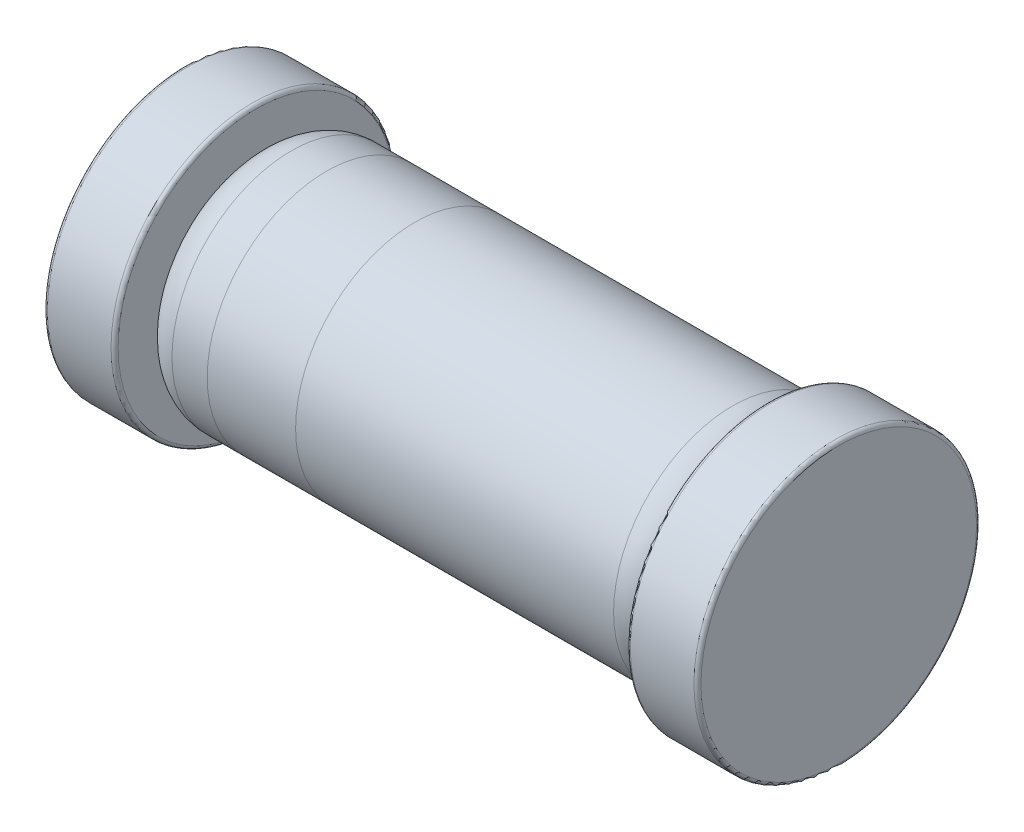
ISO-10303-21;
HEADER;
FILE_DESCRIPTION(('STEP AP214'),'2;1');
FILE_NAME('part.step','',(''),(''),'','','');
FILE_SCHEMA(('AUTOMOTIVE_DESIGN { 1 0 10303 214 1 1 1 1 }'));
ENDSEC;
DATA;
#1=APPLICATION_CONTEXT('core data for automotive mechanical design processes');
#2=APPLICATION_PROTOCOL_DEFINITION('international standard','automotive_design',2000,#1);
#3=PRODUCT_CONTEXT('',#1,'mechanical');
#4=PRODUCT('Part','Part','',(#3));
#5=PRODUCT_RELATED_PRODUCT_CATEGORY('part','',(#4));
#6=PRODUCT_DEFINITION_FORMATION('','',#4);
#7=PRODUCT_DEFINITION_CONTEXT('part definition',#1,'design');
#8=PRODUCT_DEFINITION('design','',#6,#7);
#9=PRODUCT_DEFINITION_SHAPE('','',#8);
#10=(LENGTH_UNIT() NAMED_UNIT(*) SI_UNIT(.MILLI.,.METRE.));
#11=(NAMED_UNIT(*) PLANE_ANGLE_UNIT() SI_UNIT($,.RADIAN.));
#12=(NAMED_UNIT(*) SI_UNIT($,.STERADIAN.) SOLID_ANGLE_UNIT());
#13=UNCERTAINTY_MEASURE_WITH_UNIT(LENGTH_MEASURE(1.E-05),#10,'distance_accuracy_value','');
#14=(GEOMETRIC_REPRESENTATION_CONTEXT(3) GLOBAL_UNCERTAINTY_ASSIGNED_CONTEXT((#13)) GLOBAL_UNIT_ASSIGNED_CONTEXT((#10,
#11,#12)) REPRESENTATION_CONTEXT('',''));
#15=CARTESIAN_POINT('',(0.,0.,0.));
#16=DIRECTION('',(0.,0.,1.));
#17=DIRECTION('',(1.,0.,0.));
#18=AXIS2_PLACEMENT_3D('',#15,#16,#17);
#19=CARTESIAN_POINT('',(-1.85,0.,0.));
#20=DIRECTION('',(-1.,0.,0.));
#21=DIRECTION('',(0.,0.,1.));
#22=AXIS2_PLACEMENT_3D('',#19,#20,#21);
#23=PLANE('',#22);
#24=CARTESIAN_POINT('',(-1.85,0.,0.));
#25=DIRECTION('',(1.,0.,0.));
#26=DIRECTION('',(0.,0.,-1.));
#27=AXIS2_PLACEMENT_3D('',#24,#25,#26);
#28=CIRCLE('',#27,0.78);
#29=CARTESIAN_POINT('',(-1.85,0.,-0.78));
#30=VERTEX_POINT('',#29);
#31=CARTESIAN_POINT('',(-1.85,0.,0.78));
#32=VERTEX_POINT('',#31);
#33=EDGE_CURVE('E79',#30,#32,#28,.T.);
#34=ORIENTED_EDGE('',*,*,#33,.F.);
#35=CARTESIAN_POINT('',(-1.85,0.,0.));
#36=DIRECTION('',(1.,0.,0.));
#37=DIRECTION('',(0.,0.,1.));
#38=AXIS2_PLACEMENT_3D('',#35,#36,#37);
#39=CIRCLE('',#38,0.78);
#40=EDGE_CURVE('E83',#32,#30,#39,.T.);
#41=ORIENTED_EDGE('',*,*,#40,.F.);
#42=EDGE_LOOP('',(#34,#41));
#43=FACE_BOUND('',#42,.T.);
#44=ADVANCED_FACE('F17',(#43),#23,.T.);
#45=CARTESIAN_POINT('',(-1.83,0.,0.));
#46=DIRECTION('',(-1.,0.,0.));
#47=DIRECTION('',(0.,0.,1.));
#48=AXIS2_PLACEMENT_3D('',#45,#46,#47);
#49=TOROIDAL_SURFACE('',#48,0.78,0.02);
#50=CARTESIAN_POINT('',(-1.83,0.,0.));
#51=DIRECTION('',(1.,0.,0.));
#52=DIRECTION('',(0.,0.,-1.));
#53=AXIS2_PLACEMENT_3D('',#50,#51,#52);
#54=CIRCLE('',#53,0.8);
#55=CARTESIAN_POINT('',(-1.83,0.,-0.8));
#56=VERTEX_POINT('',#55);
#57=EDGE_CURVE('E89',#56,#56,#54,.T.);
#58=ORIENTED_EDGE('',*,*,#57,.F.);
#59=EDGE_LOOP('',(#58));
#60=FACE_BOUND('',#59,.T.);
#61=ORIENTED_EDGE('',*,*,#40,.T.);
#62=ORIENTED_EDGE('',*,*,#33,.T.);
#63=EDGE_LOOP('',(#61,#62));
#64=FACE_BOUND('',#63,.T.);
#65=ADVANCED_FACE('F88',(#60,#64),#49,.T.);
#66=CARTESIAN_POINT('',(1.85,0.,0.));
#67=DIRECTION('',(1.,0.,0.));
#68=DIRECTION('',(0.,0.,-1.));
#69=AXIS2_PLACEMENT_3D('',#66,#67,#68);
#70=PLANE('',#69);
#71=CARTESIAN_POINT('',(1.85,0.,0.));
#72=DIRECTION('',(-1.,0.,0.));
#73=DIRECTION('',(0.,0.,1.));
#74=AXIS2_PLACEMENT_3D('',#71,#72,#73);
#75=CIRCLE('',#74,0.78);
#76=CARTESIAN_POINT('',(1.85,0.,0.78));
#77=VERTEX_POINT('',#76);
#78=CARTESIAN_POINT('',(1.85,0.,-0.78));
#79=VERTEX_POINT('',#78);
#80=EDGE_CURVE('E115',#77,#79,#75,.T.);
#81=ORIENTED_EDGE('',*,*,#80,.F.);
#82=CARTESIAN_POINT('',(1.85,0.,0.));
#83=DIRECTION('',(-1.,0.,0.));
#84=DIRECTION('',(0.,0.,-1.));
#85=AXIS2_PLACEMENT_3D('',#82,#83,#84);
#86=CIRCLE('',#85,0.78);
#87=EDGE_CURVE('E147',#79,#77,#86,.T.);
#88=ORIENTED_EDGE('',*,*,#87,.F.);
#89=EDGE_LOOP('',(#81,#88));
#90=FACE_BOUND('',#89,.T.);
#91=ADVANCED_FACE('F106',(#90),#70,.T.);
#92=CARTESIAN_POINT('',(-1.85,0.,0.));
#93=DIRECTION('',(1.,0.,0.));
#94=DIRECTION('',(0.,0.,-1.));
#95=AXIS2_PLACEMENT_3D('',#92,#93,#94);
#96=CYLINDRICAL_SURFACE('',#95,0.8);
#97=ORIENTED_EDGE('',*,*,#57,.T.);
#98=EDGE_LOOP('',(#97));
#99=FACE_BOUND('',#98,.T.);
#100=CARTESIAN_POINT('',(-1.47,0.,0.));
#101=DIRECTION('',(-1.,0.,0.));
#102=DIRECTION('',(0.,0.,1.));
#103=AXIS2_PLACEMENT_3D('',#100,#101,#102);
#104=CIRCLE('',#103,0.8);
#105=CARTESIAN_POINT('',(-1.47,0.,0.8));
#106=VERTEX_POINT('',#105);
#107=EDGE_CURVE('E144',#106,#106,#104,.F.);
#108=ORIENTED_EDGE('',*,*,#107,.F.);
#109=EDGE_LOOP('',(#108));
#110=FACE_BOUND('',#109,.T.);
#111=ADVANCED_FACE('F133',(#99,#110),#96,.T.);
#112=CARTESIAN_POINT('',(1.83,0.,0.));
#113=DIRECTION('',(1.,0.,0.));
#114=DIRECTION('',(0.,0.,-1.));
#115=AXIS2_PLACEMENT_3D('',#112,#113,#114);
#116=TOROIDAL_SURFACE('',#115,0.78,0.02);
#117=CARTESIAN_POINT('',(1.83,0.,0.));
#118=DIRECTION('',(-1.,0.,0.));
#119=DIRECTION('',(0.,0.,1.));
#120=AXIS2_PLACEMENT_3D('',#117,#118,#119);
#121=CIRCLE('',#120,0.8);
#122=CARTESIAN_POINT('',(1.83,0.,0.8));
#123=VERTEX_POINT('',#122);
#124=EDGE_CURVE('E142',#123,#123,#121,.T.);
#125=ORIENTED_EDGE('',*,*,#124,.F.);
#126=EDGE_LOOP('',(#125));
#127=FACE_BOUND('',#126,.T.);
#128=ORIENTED_EDGE('',*,*,#87,.T.);
#129=ORIENTED_EDGE('',*,*,#80,.T.);
#130=EDGE_LOOP('',(#128,#129));
#131=FACE_BOUND('',#130,.T.);
#132=ADVANCED_FACE('F122',(#127,#131),#116,.T.);
#133=CARTESIAN_POINT('',(-1.47,0.,0.));
#134=DIRECTION('',(-1.,0.,0.));
#135=DIRECTION('',(0.,0.,1.));
#136=AXIS2_PLACEMENT_3D('',#133,#134,#135);
#137=TOROIDAL_SURFACE('',#136,0.78,0.02);
#138=CARTESIAN_POINT('',(-1.45,0.,0.));
#139=DIRECTION('',(-1.,0.,0.));
#140=DIRECTION('',(0.,0.,1.));
#141=AXIS2_PLACEMENT_3D('',#138,#139,#140);
#142=CIRCLE('',#141,0.78);
#143=CARTESIAN_POINT('',(-1.45,0.,0.78));
#144=VERTEX_POINT('',#143);
#145=CARTESIAN_POINT('',(-1.45,0.,-0.78));
#146=VERTEX_POINT('',#145);
#147=EDGE_CURVE('E188',#144,#146,#142,.T.);
#148=ORIENTED_EDGE('',*,*,#147,.T.);
#149=CARTESIAN_POINT('',(-1.45,0.,0.));
#150=DIRECTION('',(-1.,0.,0.));
#151=DIRECTION('',(0.,0.,-1.));
#152=AXIS2_PLACEMENT_3D('',#149,#150,#151);
#153=CIRCLE('',#152,0.78);
#154=EDGE_CURVE('E241',#146,#144,#153,.T.);
#155=ORIENTED_EDGE('',*,*,#154,.T.);
#156=EDGE_LOOP('',(#148,#155));
#157=FACE_BOUND('',#156,.T.);
#158=ORIENTED_EDGE('',*,*,#107,.T.);
#159=EDGE_LOOP('',(#158));
#160=FACE_BOUND('',#159,.T.);
#161=ADVANCED_FACE('F132',(#157,#160),#137,.T.);
#162=CARTESIAN_POINT('',(1.85,0.,0.));
#163=DIRECTION('',(-1.,0.,0.));
#164=DIRECTION('',(0.,0.,1.));
#165=AXIS2_PLACEMENT_3D('',#162,#163,#164);
#166=CYLINDRICAL_SURFACE('',#165,0.8);
#167=ORIENTED_EDGE('',*,*,#124,.T.);
#168=EDGE_LOOP('',(#167));
#169=FACE_BOUND('',#168,.T.);
#170=CARTESIAN_POINT('',(1.47,0.,0.));
#171=DIRECTION('',(1.,0.,0.));
#172=DIRECTION('',(0.,0.,-1.));
#173=AXIS2_PLACEMENT_3D('',#170,#171,#172);
#174=CIRCLE('',#173,0.8);
#175=CARTESIAN_POINT('',(1.47,0.,-0.8));
#176=VERTEX_POINT('',#175);
#177=EDGE_CURVE('E278',#176,#176,#174,.F.);
#178=ORIENTED_EDGE('',*,*,#177,.F.);
#179=EDGE_LOOP('',(#178));
#180=FACE_BOUND('',#179,.T.);
#181=ADVANCED_FACE('F298',(#169,#180),#166,.T.);
#182=CARTESIAN_POINT('',(-1.45,0.,0.));
#183=DIRECTION('',(-1.,0.,0.));
#184=DIRECTION('',(0.,0.,1.));
#185=AXIS2_PLACEMENT_3D('',#182,#183,#184);
#186=PLANE('',#185);
#187=CARTESIAN_POINT('',(-1.45,0.,0.));
#188=DIRECTION('',(1.,0.,0.));
#189=DIRECTION('',(0.,0.,1.));
#190=AXIS2_PLACEMENT_3D('',#187,#188,#189);
#191=CIRCLE('',#190,0.475);
#192=CARTESIAN_POINT('',(-1.45,0.,0.475));
#193=VERTEX_POINT('',#192);
#194=CARTESIAN_POINT('',(-1.45,0.,-0.475));
#195=VERTEX_POINT('',#194);
#196=EDGE_CURVE('E253',#193,#195,#191,.T.);
#197=ORIENTED_EDGE('',*,*,#196,.F.);
#198=CARTESIAN_POINT('',(-1.45,0.,0.));
#199=DIRECTION('',(1.,0.,0.));
#200=DIRECTION('',(0.,0.,-1.));
#201=AXIS2_PLACEMENT_3D('',#198,#199,#200);
#202=CIRCLE('',#201,0.475);
#203=EDGE_CURVE('E264',#195,#193,#202,.T.);
#204=ORIENTED_EDGE('',*,*,#203,.F.);
#205=EDGE_LOOP('',(#197,#204));
#206=FACE_BOUND('',#205,.T.);
#207=ORIENTED_EDGE('',*,*,#147,.F.);
#208=ORIENTED_EDGE('',*,*,#154,.F.);
#209=EDGE_LOOP('',(#207,#208));
#210=FACE_BOUND('',#209,.T.);
#211=ADVANCED_FACE('F207',(#206,#210),#186,.F.);
#212=CARTESIAN_POINT('',(1.47,0.,0.));
#213=DIRECTION('',(1.,0.,0.));
#214=DIRECTION('',(0.,0.,-1.));
#215=AXIS2_PLACEMENT_3D('',#212,#213,#214);
#216=TOROIDAL_SURFACE('',#215,0.78,0.02);
#217=CARTESIAN_POINT('',(1.45,0.,0.));
#218=DIRECTION('',(1.,0.,0.));
#219=DIRECTION('',(0.,0.,-1.));
#220=AXIS2_PLACEMENT_3D('',#217,#218,#219);
#221=CIRCLE('',#220,0.78);
#222=CARTESIAN_POINT('',(1.45,0.,-0.78));
#223=VERTEX_POINT('',#222);
#224=CARTESIAN_POINT('',(1.45,0.,0.78));
#225=VERTEX_POINT('',#224);
#226=EDGE_CURVE('E405',#223,#225,#221,.T.);
#227=ORIENTED_EDGE('',*,*,#226,.T.);
#228=CARTESIAN_POINT('',(1.45,0.,0.));
#229=DIRECTION('',(1.,0.,0.));
#230=DIRECTION('',(0.,0.,1.));
#231=AXIS2_PLACEMENT_3D('',#228,#229,#230);
#232=CIRCLE('',#231,0.78);
#233=EDGE_CURVE('E220',#225,#223,#232,.T.);
#234=ORIENTED_EDGE('',*,*,#233,.T.);
#235=EDGE_LOOP('',(#227,#234));
#236=FACE_BOUND('',#235,.T.);
#237=ORIENTED_EDGE('',*,*,#177,.T.);
#238=EDGE_LOOP('',(#237));
#239=FACE_BOUND('',#238,.T.);
#240=ADVANCED_FACE('F195',(#236,#239),#216,.T.);
#241=CARTESIAN_POINT('',(-1.25,0.,0.));
#242=DIRECTION('',(-1.,0.,0.));
#243=DIRECTION('',(0.,0.,1.));
#244=AXIS2_PLACEMENT_3D('',#241,#242,#243);
#245=TOROIDAL_SURFACE('',#244,0.475,0.2);
#246=ORIENTED_EDGE('',*,*,#196,.T.);
#247=ORIENTED_EDGE('',*,*,#203,.T.);
#248=EDGE_LOOP('',(#246,#247));
#249=FACE_BOUND('',#248,.T.);
#250=CARTESIAN_POINT('',(-1.25,0.,0.));
#251=DIRECTION('',(1.,0.,0.));
#252=DIRECTION('',(0.,0.,-1.));
#253=AXIS2_PLACEMENT_3D('',#250,#251,#252);
#254=CIRCLE('',#253,0.675);
#255=CARTESIAN_POINT('',(-1.25,0.,-0.675));
#256=VERTEX_POINT('',#255);
#257=EDGE_CURVE('E446',#256,#256,#254,.T.);
#258=ORIENTED_EDGE('',*,*,#257,.F.);
#259=EDGE_LOOP('',(#258));
#260=FACE_BOUND('',#259,.T.);
#261=ADVANCED_FACE('F206',(#249,#260),#245,.T.);
#262=CARTESIAN_POINT('',(1.45,0.,0.));
#263=DIRECTION('',(1.,0.,0.));
#264=DIRECTION('',(0.,0.,-1.));
#265=AXIS2_PLACEMENT_3D('',#262,#263,#264);
#266=PLANE('',#265);
#267=CARTESIAN_POINT('',(1.45,0.,0.));
#268=DIRECTION('',(-1.,0.,0.));
#269=DIRECTION('',(0.,0.,-1.));
#270=AXIS2_PLACEMENT_3D('',#267,#268,#269);
#271=CIRCLE('',#270,0.475);
#272=CARTESIAN_POINT('',(1.45,0.,-0.475));
#273=VERTEX_POINT('',#272);
#274=CARTESIAN_POINT('',(1.45,0.,0.475));
#275=VERTEX_POINT('',#274);
#276=EDGE_CURVE('E360',#273,#275,#271,.T.);
#277=ORIENTED_EDGE('',*,*,#276,.F.);
#278=CARTESIAN_POINT('',(1.45,0.,0.));
#279=DIRECTION('',(-1.,0.,0.));
#280=DIRECTION('',(0.,0.,1.));
#281=AXIS2_PLACEMENT_3D('',#278,#279,#280);
#282=CIRCLE('',#281,0.475);
#283=EDGE_CURVE('E435',#275,#273,#282,.T.);
#284=ORIENTED_EDGE('',*,*,#283,.F.);
#285=EDGE_LOOP('',(#277,#284));
#286=FACE_BOUND('',#285,.T.);
#287=ORIENTED_EDGE('',*,*,#226,.F.);
#288=ORIENTED_EDGE('',*,*,#233,.F.);
#289=EDGE_LOOP('',(#287,#288));
#290=FACE_BOUND('',#289,.T.);
#291=ADVANCED_FACE('F410',(#286,#290),#266,.F.);
#292=CARTESIAN_POINT('',(-1.45,0.,0.));
#293=DIRECTION('',(1.,0.,0.));
#294=DIRECTION('',(0.,0.,-1.));
#295=AXIS2_PLACEMENT_3D('',#292,#293,#294);
#296=CYLINDRICAL_SURFACE('',#295,0.675);
#297=CARTESIAN_POINT('',(-1.05,0.,0.));
#298=DIRECTION('',(1.,0.,0.));
#299=DIRECTION('',(0.,0.,1.));
#300=AXIS2_PLACEMENT_3D('',#297,#298,#299);
#301=CIRCLE('',#300,0.6755);
#302=CARTESIAN_POINT('',(-1.05,0.,0.67525));
#303=VERTEX_POINT('',#302);
#304=CARTESIAN_POINT('',(-1.05,0.,-0.67525));
#305=VERTEX_POINT('',#304);
#306=EDGE_CURVE('E348',#303,#305,#301,.T.);
#307=ORIENTED_EDGE('',*,*,#306,.F.);
#308=CARTESIAN_POINT('',(-1.05,0.,0.));
#309=DIRECTION('',(1.,0.,0.));
#310=DIRECTION('',(0.,0.,-1.));
#311=AXIS2_PLACEMENT_3D('',#308,#309,#310);
#312=CIRCLE('',#311,0.6755);
#313=EDGE_CURVE('E384',#305,#303,#312,.T.);
#314=ORIENTED_EDGE('',*,*,#313,.F.);
#315=EDGE_LOOP('',(#307,#314));
#316=FACE_BOUND('',#315,.T.);
#317=ORIENTED_EDGE('',*,*,#257,.T.);
#318=EDGE_LOOP('',(#317));
#319=FACE_BOUND('',#318,.T.);
#320=ADVANCED_FACE('F375',(#316,#319),#296,.T.);
#321=CARTESIAN_POINT('',(1.25,0.,0.));
#322=DIRECTION('',(1.,0.,0.));
#323=DIRECTION('',(0.,0.,-1.));
#324=AXIS2_PLACEMENT_3D('',#321,#322,#323);
#325=TOROIDAL_SURFACE('',#324,0.475,0.2);
#326=ORIENTED_EDGE('',*,*,#276,.T.);
#327=ORIENTED_EDGE('',*,*,#283,.T.);
#328=EDGE_LOOP('',(#326,#327));
#329=FACE_BOUND('',#328,.T.);
#330=CARTESIAN_POINT('',(1.25,0.,0.));
#331=DIRECTION('',(-1.,0.,0.));
#332=DIRECTION('',(0.,0.,1.));
#333=AXIS2_PLACEMENT_3D('',#330,#331,#332);
#334=CIRCLE('',#333,0.675);
#335=CARTESIAN_POINT('',(1.25,0.,0.675));
#336=VERTEX_POINT('',#335);
#337=EDGE_CURVE('E28',#336,#336,#334,.T.);
#338=ORIENTED_EDGE('',*,*,#337,.F.);
#339=EDGE_LOOP('',(#338));
#340=FACE_BOUND('',#339,.T.);
#341=ADVANCED_FACE('F316',(#329,#340),#325,.T.);
#342=CARTESIAN_POINT('',(-1.05,0.,0.));
#343=DIRECTION('',(1.,0.,0.));
#344=DIRECTION('',(0.,0.,-1.));
#345=AXIS2_PLACEMENT_3D('',#342,#343,#344);
#346=CYLINDRICAL_SURFACE('',#345,0.6755);
#347=CARTESIAN_POINT('',(-0.55,0.,0.));
#348=DIRECTION('',(1.,0.,0.));
#349=DIRECTION('',(0.,0.,1.));
#350=AXIS2_PLACEMENT_3D('',#347,#348,#349);
#351=CIRCLE('',#350,0.675);
#352=CARTESIAN_POINT('',(-0.55,0.,0.67525));
#353=VERTEX_POINT('',#352);
#354=CARTESIAN_POINT('',(-0.55,0.,-0.67525));
#355=VERTEX_POINT('',#354);
#356=EDGE_CURVE('E35',#353,#355,#351,.T.);
#357=ORIENTED_EDGE('',*,*,#356,.F.);
#358=CARTESIAN_POINT('',(-0.55,0.,0.));
#359=DIRECTION('',(1.,0.,0.));
#360=DIRECTION('',(0.,0.,-1.));
#361=AXIS2_PLACEMENT_3D('',#358,#359,#360);
#362=CIRCLE('',#361,0.675);
#363=EDGE_CURVE('E11',#355,#353,#362,.T.);
#364=ORIENTED_EDGE('',*,*,#363,.F.);
#365=EDGE_LOOP('',(#357,#364));
#366=FACE_BOUND('',#365,.T.);
#367=ORIENTED_EDGE('',*,*,#313,.T.);
#368=ORIENTED_EDGE('',*,*,#306,.T.);
#369=EDGE_LOOP('',(#367,#368));
#370=FACE_BOUND('',#369,.T.);
#371=ADVANCED_FACE('F310',(#366,#370),#346,.T.);
#372=CARTESIAN_POINT('',(1.45,0.,0.));
#373=DIRECTION('',(-1.,0.,0.));
#374=DIRECTION('',(0.,0.,1.));
#375=AXIS2_PLACEMENT_3D('',#372,#373,#374);
#376=CYLINDRICAL_SURFACE('',#375,0.675);
#377=ORIENTED_EDGE('',*,*,#356,.T.);
#378=ORIENTED_EDGE('',*,*,#363,.T.);
#379=EDGE_LOOP('',(#377,#378));
#380=FACE_BOUND('',#379,.T.);
#381=ORIENTED_EDGE('',*,*,#337,.T.);
#382=EDGE_LOOP('',(#381));
#383=FACE_BOUND('',#382,.T.);
#384=ADVANCED_FACE('F308',(#380,#383),#376,.T.);
#385=CLOSED_SHELL('',(#44,#65,#91,#111,#132,#161,#181,#211,#240,#261,#291,#320,#341,#371,#384));
#386=MANIFOLD_SOLID_BREP('B1',#385);
#387=ADVANCED_BREP_SHAPE_REPRESENTATION('',(#18,#386),#14);
#388=SHAPE_DEFINITION_REPRESENTATION(#9,#387);
ENDSEC;
END-ISO-10303-21;
